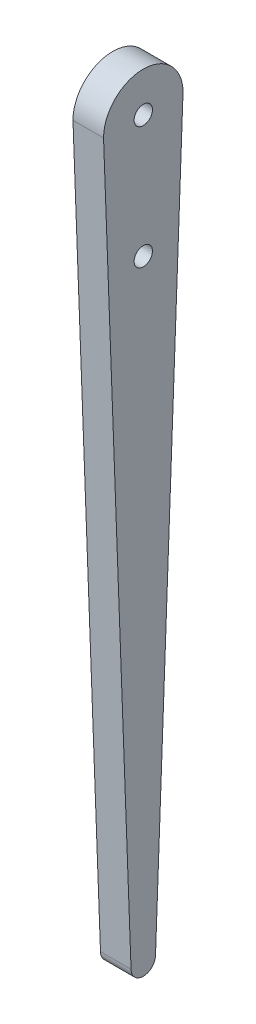
ISO-10303-21;
HEADER;
FILE_DESCRIPTION(('STEP AP214'),'2;1');
FILE_NAME('part.step','',(''),(''),'','','');
FILE_SCHEMA(('AUTOMOTIVE_DESIGN { 1 0 10303 214 1 1 1 1 }'));
ENDSEC;
DATA;
#1=APPLICATION_CONTEXT('core data for automotive mechanical design processes');
#2=APPLICATION_PROTOCOL_DEFINITION('international standard','automotive_design',2000,#1);
#3=PRODUCT_CONTEXT('',#1,'mechanical');
#4=PRODUCT('Part','Part','',(#3));
#5=PRODUCT_RELATED_PRODUCT_CATEGORY('part','',(#4));
#6=PRODUCT_DEFINITION_FORMATION('','',#4);
#7=PRODUCT_DEFINITION_CONTEXT('part definition',#1,'design');
#8=PRODUCT_DEFINITION('design','',#6,#7);
#9=PRODUCT_DEFINITION_SHAPE('','',#8);
#10=(LENGTH_UNIT() NAMED_UNIT(*) SI_UNIT(.MILLI.,.METRE.));
#11=(NAMED_UNIT(*) PLANE_ANGLE_UNIT() SI_UNIT($,.RADIAN.));
#12=(NAMED_UNIT(*) SI_UNIT($,.STERADIAN.) SOLID_ANGLE_UNIT());
#13=UNCERTAINTY_MEASURE_WITH_UNIT(LENGTH_MEASURE(1.E-05),#10,'distance_accuracy_value','');
#14=(GEOMETRIC_REPRESENTATION_CONTEXT(3) GLOBAL_UNCERTAINTY_ASSIGNED_CONTEXT((#13)) GLOBAL_UNIT_ASSIGNED_CONTEXT((#10,
#11,#12)) REPRESENTATION_CONTEXT('',''));
#15=CARTESIAN_POINT('',(0.,0.,0.));
#16=DIRECTION('',(0.,0.,1.));
#17=DIRECTION('',(1.,0.,0.));
#18=AXIS2_PLACEMENT_3D('',#15,#16,#17);
#19=CARTESIAN_POINT('',(5.,60.,0.));
#20=DIRECTION('',(-1.,0.,0.));
#21=DIRECTION('',(0.,0.,1.));
#22=AXIS2_PLACEMENT_3D('',#19,#20,#21);
#23=PLANE('',#22);
#24=CARTESIAN_POINT('',(5.,60.,0.));
#25=DIRECTION('',(1.,0.,0.));
#26=DIRECTION('',(0.,0.,1.));
#27=AXIS2_PLACEMENT_3D('',#24,#25,#26);
#28=CIRCLE('',#27,6.50000000000003);
#29=CARTESIAN_POINT('',(5.,60.,-6.50000000000003));
#30=VERTEX_POINT('',#29);
#31=CARTESIAN_POINT('',(5.,60.,6.50000000000003));
#32=VERTEX_POINT('',#31);
#33=EDGE_CURVE('E92',#30,#32,#28,.T.);
#34=ORIENTED_EDGE('',*,*,#33,.T.);
#35=DIRECTION('',(0.,-0.999297615709181,-0.0374736605890946));
#36=VECTOR('',#35,1.);
#37=CARTESIAN_POINT('',(5.,60.,6.50000000000003));
#38=LINE('',#37,#36);
#39=CARTESIAN_POINT('',(5.,-60.,1.99999999999999));
#40=VERTEX_POINT('',#39);
#41=EDGE_CURVE('E87',#32,#40,#38,.T.);
#42=ORIENTED_EDGE('',*,*,#41,.T.);
#43=CARTESIAN_POINT('',(5.,-60.,0.));
#44=DIRECTION('',(1.,0.,0.));
#45=DIRECTION('',(0.,0.,1.));
#46=AXIS2_PLACEMENT_3D('',#43,#44,#45);
#47=CIRCLE('',#46,1.99999999999999);
#48=CARTESIAN_POINT('',(5.,-60.,-2.));
#49=VERTEX_POINT('',#48);
#50=EDGE_CURVE('E90',#40,#49,#47,.T.);
#51=ORIENTED_EDGE('',*,*,#50,.T.);
#52=DIRECTION('',(0.,0.999297615709181,-0.0374736605890946));
#53=VECTOR('',#52,1.);
#54=CARTESIAN_POINT('',(5.,60.,-6.50000000000003));
#55=LINE('',#54,#53);
#56=EDGE_CURVE('E57',#49,#30,#55,.T.);
#57=ORIENTED_EDGE('',*,*,#56,.T.);
#58=EDGE_LOOP('',(#34,#42,#51,#57));
#59=FACE_BOUND('',#58,.T.);
#60=CARTESIAN_POINT('',(5.,60.,0.));
#61=DIRECTION('',(1.,0.,0.));
#62=DIRECTION('',(0.,0.,-1.));
#63=AXIS2_PLACEMENT_3D('',#60,#61,#62);
#64=CIRCLE('',#63,1.5);
#65=CARTESIAN_POINT('',(5.,60.,-1.49999999999997));
#66=VERTEX_POINT('',#65);
#67=EDGE_CURVE('E112',#66,#66,#64,.T.);
#68=ORIENTED_EDGE('',*,*,#67,.F.);
#69=EDGE_LOOP('',(#68));
#70=FACE_BOUND('',#69,.T.);
#71=CARTESIAN_POINT('',(5.,40.,0.));
#72=DIRECTION('',(1.,0.,0.));
#73=DIRECTION('',(0.,0.,-1.));
#74=AXIS2_PLACEMENT_3D('',#71,#72,#73);
#75=CIRCLE('',#74,1.5);
#76=CARTESIAN_POINT('',(5.,40.,-1.5));
#77=VERTEX_POINT('',#76);
#78=EDGE_CURVE('E134',#77,#77,#75,.T.);
#79=ORIENTED_EDGE('',*,*,#78,.F.);
#80=EDGE_LOOP('',(#79));
#81=FACE_BOUND('',#80,.T.);
#82=ADVANCED_FACE('F39',(#59,#70,#81),#23,.F.);
#83=CARTESIAN_POINT('',(0.,60.,0.));
#84=DIRECTION('',(-1.,0.,0.));
#85=DIRECTION('',(0.,0.,1.));
#86=AXIS2_PLACEMENT_3D('',#83,#84,#85);
#87=PLANE('',#86);
#88=CARTESIAN_POINT('',(0.,60.,0.));
#89=DIRECTION('',(1.,0.,0.));
#90=DIRECTION('',(0.,0.,-1.));
#91=AXIS2_PLACEMENT_3D('',#88,#89,#90);
#92=CIRCLE('',#91,1.5);
#93=CARTESIAN_POINT('',(0.,60.,-1.49999999999997));
#94=VERTEX_POINT('',#93);
#95=EDGE_CURVE('E130',#94,#94,#92,.T.);
#96=ORIENTED_EDGE('',*,*,#95,.T.);
#97=EDGE_LOOP('',(#96));
#98=FACE_BOUND('',#97,.T.);
#99=CARTESIAN_POINT('',(0.,60.,0.));
#100=DIRECTION('',(1.,0.,0.));
#101=DIRECTION('',(0.,0.,1.));
#102=AXIS2_PLACEMENT_3D('',#99,#100,#101);
#103=CIRCLE('',#102,6.50000000000003);
#104=CARTESIAN_POINT('',(0.,60.,-6.50000000000003));
#105=VERTEX_POINT('',#104);
#106=CARTESIAN_POINT('',(0.,60.,6.50000000000003));
#107=VERTEX_POINT('',#106);
#108=EDGE_CURVE('E108',#105,#107,#103,.T.);
#109=ORIENTED_EDGE('',*,*,#108,.F.);
#110=DIRECTION('',(0.,0.999297615709181,-0.0374736605890946));
#111=VECTOR('',#110,1.);
#112=CARTESIAN_POINT('',(0.,60.,-6.50000000000003));
#113=LINE('',#112,#111);
#114=CARTESIAN_POINT('',(0.,-60.,-2.));
#115=VERTEX_POINT('',#114);
#116=EDGE_CURVE('E80',#115,#105,#113,.T.);
#117=ORIENTED_EDGE('',*,*,#116,.F.);
#118=CARTESIAN_POINT('',(0.,-60.,0.));
#119=DIRECTION('',(1.,0.,0.));
#120=DIRECTION('',(0.,0.,1.));
#121=AXIS2_PLACEMENT_3D('',#118,#119,#120);
#122=CIRCLE('',#121,1.99999999999999);
#123=CARTESIAN_POINT('',(0.,-60.,1.99999999999999));
#124=VERTEX_POINT('',#123);
#125=EDGE_CURVE('E74',#124,#115,#122,.T.);
#126=ORIENTED_EDGE('',*,*,#125,.F.);
#127=DIRECTION('',(0.,-0.999297615709181,-0.0374736605890946));
#128=VECTOR('',#127,1.);
#129=CARTESIAN_POINT('',(0.,60.,6.50000000000003));
#130=LINE('',#129,#128);
#131=EDGE_CURVE('E97',#107,#124,#130,.T.);
#132=ORIENTED_EDGE('',*,*,#131,.F.);
#133=EDGE_LOOP('',(#109,#117,#126,#132));
#134=FACE_BOUND('',#133,.T.);
#135=CARTESIAN_POINT('',(0.,40.,0.));
#136=DIRECTION('',(1.,0.,0.));
#137=DIRECTION('',(0.,0.,-1.));
#138=AXIS2_PLACEMENT_3D('',#135,#136,#137);
#139=CIRCLE('',#138,1.5);
#140=CARTESIAN_POINT('',(0.,40.,-1.5));
#141=VERTEX_POINT('',#140);
#142=EDGE_CURVE('E138',#141,#141,#139,.T.);
#143=ORIENTED_EDGE('',*,*,#142,.T.);
#144=EDGE_LOOP('',(#143));
#145=FACE_BOUND('',#144,.T.);
#146=ADVANCED_FACE('F125',(#98,#134,#145),#87,.T.);
#147=CARTESIAN_POINT('',(5.,60.,0.));
#148=DIRECTION('',(-1.,0.,0.));
#149=DIRECTION('',(0.,0.,1.));
#150=AXIS2_PLACEMENT_3D('',#147,#148,#149);
#151=CYLINDRICAL_SURFACE('',#150,6.50000000000003);
#152=ORIENTED_EDGE('',*,*,#108,.T.);
#153=DIRECTION('',(-1.,0.,0.));
#154=VECTOR('',#153,1.);
#155=CARTESIAN_POINT('',(5.,60.,6.50000000000003));
#156=LINE('',#155,#154);
#157=EDGE_CURVE('E11',#32,#107,#156,.T.);
#158=ORIENTED_EDGE('',*,*,#157,.F.);
#159=ORIENTED_EDGE('',*,*,#33,.F.);
#160=DIRECTION('',(-1.,0.,0.));
#161=VECTOR('',#160,1.);
#162=CARTESIAN_POINT('',(5.,60.,-6.50000000000003));
#163=LINE('',#162,#161);
#164=EDGE_CURVE('E104',#30,#105,#163,.T.);
#165=ORIENTED_EDGE('',*,*,#164,.T.);
#166=EDGE_LOOP('',(#152,#158,#159,#165));
#167=FACE_BOUND('',#166,.T.);
#168=ADVANCED_FACE('F41',(#167),#151,.T.);
#169=CARTESIAN_POINT('',(5.,60.,6.50000000000003));
#170=DIRECTION('',(0.,0.0374736605890946,-0.999297615709181));
#171=DIRECTION('',(0.,0.999297615709181,0.0374736605890946));
#172=AXIS2_PLACEMENT_3D('',#169,#170,#171);
#173=PLANE('',#172);
#174=ORIENTED_EDGE('',*,*,#131,.T.);
#175=DIRECTION('',(-1.,0.,0.));
#176=VECTOR('',#175,1.);
#177=CARTESIAN_POINT('',(5.,-60.,1.99999999999999));
#178=LINE('',#177,#176);
#179=EDGE_CURVE('E49',#40,#124,#178,.T.);
#180=ORIENTED_EDGE('',*,*,#179,.F.);
#181=ORIENTED_EDGE('',*,*,#41,.F.);
#182=ORIENTED_EDGE('',*,*,#157,.T.);
#183=EDGE_LOOP('',(#174,#180,#181,#182));
#184=FACE_BOUND('',#183,.T.);
#185=ADVANCED_FACE('F96',(#184),#173,.F.);
#186=CARTESIAN_POINT('',(5.,-60.,0.));
#187=DIRECTION('',(-1.,0.,0.));
#188=DIRECTION('',(0.,0.,1.));
#189=AXIS2_PLACEMENT_3D('',#186,#187,#188);
#190=CYLINDRICAL_SURFACE('',#189,1.99999999999999);
#191=ORIENTED_EDGE('',*,*,#125,.T.);
#192=DIRECTION('',(-1.,0.,0.));
#193=VECTOR('',#192,1.);
#194=CARTESIAN_POINT('',(5.,-60.,-2.));
#195=LINE('',#194,#193);
#196=EDGE_CURVE('E99',#49,#115,#195,.T.);
#197=ORIENTED_EDGE('',*,*,#196,.F.);
#198=ORIENTED_EDGE('',*,*,#50,.F.);
#199=ORIENTED_EDGE('',*,*,#179,.T.);
#200=EDGE_LOOP('',(#191,#197,#198,#199));
#201=FACE_BOUND('',#200,.T.);
#202=ADVANCED_FACE('F100',(#201),#190,.T.);
#203=CARTESIAN_POINT('',(5.,60.,-6.50000000000003));
#204=DIRECTION('',(0.,0.0374736605890946,0.999297615709181));
#205=DIRECTION('',(0.,-0.999297615709181,0.0374736605890946));
#206=AXIS2_PLACEMENT_3D('',#203,#204,#205);
#207=PLANE('',#206);
#208=ORIENTED_EDGE('',*,*,#116,.T.);
#209=ORIENTED_EDGE('',*,*,#164,.F.);
#210=ORIENTED_EDGE('',*,*,#56,.F.);
#211=ORIENTED_EDGE('',*,*,#196,.T.);
#212=EDGE_LOOP('',(#208,#209,#210,#211));
#213=FACE_BOUND('',#212,.T.);
#214=ADVANCED_FACE('F122',(#213),#207,.F.);
#215=CARTESIAN_POINT('',(5.,60.,0.));
#216=DIRECTION('',(-1.,0.,0.));
#217=DIRECTION('',(0.,0.,1.));
#218=AXIS2_PLACEMENT_3D('',#215,#216,#217);
#219=CYLINDRICAL_SURFACE('',#218,1.5);
#220=ORIENTED_EDGE('',*,*,#67,.T.);
#221=EDGE_LOOP('',(#220));
#222=FACE_BOUND('',#221,.T.);
#223=ORIENTED_EDGE('',*,*,#95,.F.);
#224=EDGE_LOOP('',(#223));
#225=FACE_BOUND('',#224,.T.);
#226=ADVANCED_FACE('F157',(#222,#225),#219,.F.);
#227=CARTESIAN_POINT('',(5.,40.,0.));
#228=DIRECTION('',(-1.,0.,0.));
#229=DIRECTION('',(0.,0.,1.));
#230=AXIS2_PLACEMENT_3D('',#227,#228,#229);
#231=CYLINDRICAL_SURFACE('',#230,1.5);
#232=ORIENTED_EDGE('',*,*,#78,.T.);
#233=EDGE_LOOP('',(#232));
#234=FACE_BOUND('',#233,.T.);
#235=ORIENTED_EDGE('',*,*,#142,.F.);
#236=EDGE_LOOP('',(#235));
#237=FACE_BOUND('',#236,.T.);
#238=ADVANCED_FACE('F146',(#234,#237),#231,.F.);
#239=CLOSED_SHELL('',(#82,#146,#168,#185,#202,#214,#226,#238));
#240=MANIFOLD_SOLID_BREP('B2',#239);
#241=ADVANCED_BREP_SHAPE_REPRESENTATION('',(#18,#240),#14);
#242=SHAPE_DEFINITION_REPRESENTATION(#9,#241);
ENDSEC;
END-ISO-10303-21;
